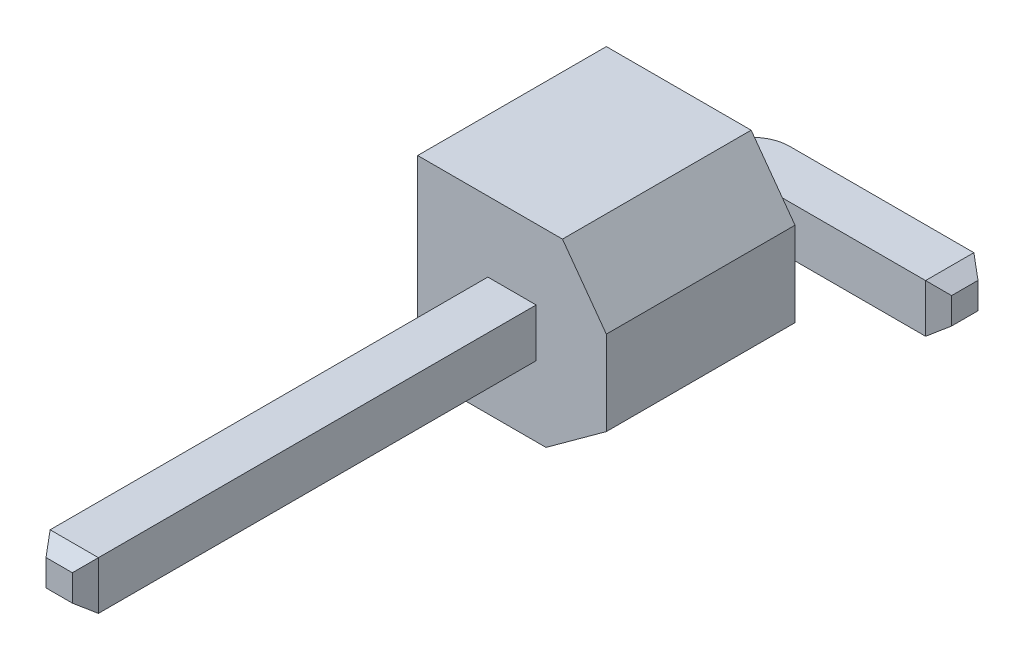
ISO-10303-21;
HEADER;
FILE_DESCRIPTION(('STEP AP214'),'2;1');
FILE_NAME('part.step','',(''),(''),'','','');
FILE_SCHEMA(('AUTOMOTIVE_DESIGN { 1 0 10303 214 1 1 1 1 }'));
ENDSEC;
DATA;
#1=APPLICATION_CONTEXT('core data for automotive mechanical design processes');
#2=APPLICATION_PROTOCOL_DEFINITION('international standard','automotive_design',2000,#1);
#3=PRODUCT_CONTEXT('',#1,'mechanical');
#4=PRODUCT('Part','Part','',(#3));
#5=PRODUCT_RELATED_PRODUCT_CATEGORY('part','',(#4));
#6=PRODUCT_DEFINITION_FORMATION('','',#4);
#7=PRODUCT_DEFINITION_CONTEXT('part definition',#1,'design');
#8=PRODUCT_DEFINITION('design','',#6,#7);
#9=PRODUCT_DEFINITION_SHAPE('','',#8);
#10=(LENGTH_UNIT() NAMED_UNIT(*) SI_UNIT(.MILLI.,.METRE.));
#11=(NAMED_UNIT(*) PLANE_ANGLE_UNIT() SI_UNIT($,.RADIAN.));
#12=(NAMED_UNIT(*) SI_UNIT($,.STERADIAN.) SOLID_ANGLE_UNIT());
#13=UNCERTAINTY_MEASURE_WITH_UNIT(LENGTH_MEASURE(1.E-05),#10,'distance_accuracy_value','');
#14=(GEOMETRIC_REPRESENTATION_CONTEXT(3) GLOBAL_UNCERTAINTY_ASSIGNED_CONTEXT((#13)) GLOBAL_UNIT_ASSIGNED_CONTEXT((#10,
#11,#12)) REPRESENTATION_CONTEXT('',''));
#15=CARTESIAN_POINT('',(0.,0.,0.));
#16=DIRECTION('',(0.,0.,1.));
#17=DIRECTION('',(1.,0.,0.));
#18=AXIS2_PLACEMENT_3D('',#15,#16,#17);
#19=CARTESIAN_POINT('',(0.32,0.32,-0.905096679918781));
#20=DIRECTION('',(1.,0.,0.));
#21=DIRECTION('',(0.,1.,0.));
#22=AXIS2_PLACEMENT_3D('',#19,#20,#21);
#23=PLANE('',#22);
#24=DIRECTION('',(0.,0.,1.));
#25=VECTOR('',#24,1.);
#26=CARTESIAN_POINT('',(0.32,-0.32,-0.905096679918781));
#27=LINE('',#26,#25);
#28=CARTESIAN_POINT('',(0.32,-0.32,0.64));
#29=VERTEX_POINT('',#28);
#30=CARTESIAN_POINT('',(0.32,-0.32,1.));
#31=VERTEX_POINT('',#30);
#32=EDGE_CURVE('E199',#29,#31,#27,.T.);
#33=ORIENTED_EDGE('',*,*,#32,.F.);
#34=DIRECTION('',(0.,-1.,0.));
#35=VECTOR('',#34,1.);
#36=CARTESIAN_POINT('',(0.32,-0.32,0.64));
#37=LINE('',#36,#35);
#38=CARTESIAN_POINT('',(0.32,0.32,0.64));
#39=VERTEX_POINT('',#38);
#40=EDGE_CURVE('E184',#39,#29,#37,.T.);
#41=ORIENTED_EDGE('',*,*,#40,.F.);
#42=DIRECTION('',(0.,0.,1.));
#43=VECTOR('',#42,1.);
#44=CARTESIAN_POINT('',(0.32,0.32,-0.905096679918781));
#45=LINE('',#44,#43);
#46=CARTESIAN_POINT('',(0.32,0.32,1.));
#47=VERTEX_POINT('',#46);
#48=EDGE_CURVE('E197',#39,#47,#45,.T.);
#49=ORIENTED_EDGE('',*,*,#48,.T.);
#50=DIRECTION('',(0.,-1.,0.));
#51=VECTOR('',#50,1.);
#52=CARTESIAN_POINT('',(0.32,0.,1.));
#53=LINE('',#52,#51);
#54=EDGE_CURVE('E259',#47,#31,#53,.T.);
#55=ORIENTED_EDGE('',*,*,#54,.T.);
#56=EDGE_LOOP('',(#33,#41,#49,#55));
#57=FACE_BOUND('',#56,.T.);
#58=ADVANCED_FACE('F35',(#57),#23,.T.);
#59=CARTESIAN_POINT('',(1.25,-1.25,3.5));
#60=DIRECTION('',(-1.,0.,0.));
#61=DIRECTION('',(0.,0.,1.));
#62=AXIS2_PLACEMENT_3D('',#59,#60,#61);
#63=PLANE('',#62);
#64=DIRECTION('',(0.,1.,0.));
#65=VECTOR('',#64,1.);
#66=CARTESIAN_POINT('',(1.25,-1.25,1.));
#67=LINE('',#66,#65);
#68=CARTESIAN_POINT('',(1.25,-0.668765977595712,1.));
#69=VERTEX_POINT('',#68);
#70=CARTESIAN_POINT('',(1.25,0.449999999999996,1.));
#71=VERTEX_POINT('',#70);
#72=EDGE_CURVE('E230',#69,#71,#67,.T.);
#73=ORIENTED_EDGE('',*,*,#72,.T.);
#74=DIRECTION('',(0.,0.,1.));
#75=VECTOR('',#74,1.);
#76=CARTESIAN_POINT('',(1.25,0.449999999999996,3.5));
#77=LINE('',#76,#75);
#78=CARTESIAN_POINT('',(1.25,0.449999999999996,3.5));
#79=VERTEX_POINT('',#78);
#80=EDGE_CURVE('E56',#71,#79,#77,.T.);
#81=ORIENTED_EDGE('',*,*,#80,.T.);
#82=DIRECTION('',(0.,1.,0.));
#83=VECTOR('',#82,1.);
#84=CARTESIAN_POINT('',(1.25,-1.25,3.5));
#85=LINE('',#84,#83);
#86=CARTESIAN_POINT('',(1.25,-0.668765977595712,3.5));
#87=VERTEX_POINT('',#86);
#88=EDGE_CURVE('E231',#87,#79,#85,.T.);
#89=ORIENTED_EDGE('',*,*,#88,.F.);
#90=DIRECTION('',(0.,0.,-1.));
#91=VECTOR('',#90,1.);
#92=CARTESIAN_POINT('',(1.25,-0.668765977595712,3.5));
#93=LINE('',#92,#91);
#94=EDGE_CURVE('E331',#87,#69,#93,.T.);
#95=ORIENTED_EDGE('',*,*,#94,.T.);
#96=EDGE_LOOP('',(#73,#81,#89,#95));
#97=FACE_BOUND('',#96,.T.);
#98=ADVANCED_FACE('F352',(#97),#63,.F.);
#99=CARTESIAN_POINT('',(-1.25,1.25,3.5));
#100=DIRECTION('',(0.,-1.,0.));
#101=DIRECTION('',(0.,0.,-1.));
#102=AXIS2_PLACEMENT_3D('',#99,#100,#101);
#103=PLANE('',#102);
#104=DIRECTION('',(-1.,0.,0.));
#105=VECTOR('',#104,1.);
#106=CARTESIAN_POINT('',(-1.25,1.25,3.5));
#107=LINE('',#106,#105);
#108=CARTESIAN_POINT('',(0.668765977595712,1.25,3.5));
#109=VERTEX_POINT('',#108);
#110=CARTESIAN_POINT('',(-1.25,1.25,3.5));
#111=VERTEX_POINT('',#110);
#112=EDGE_CURVE('E233',#109,#111,#107,.T.);
#113=ORIENTED_EDGE('',*,*,#112,.F.);
#114=DIRECTION('',(0.,0.,-1.));
#115=VECTOR('',#114,1.);
#116=CARTESIAN_POINT('',(0.668765977595712,1.25,3.5));
#117=LINE('',#116,#115);
#118=CARTESIAN_POINT('',(0.668765977595712,1.25,1.));
#119=VERTEX_POINT('',#118);
#120=EDGE_CURVE('E305',#109,#119,#117,.T.);
#121=ORIENTED_EDGE('',*,*,#120,.T.);
#122=DIRECTION('',(-1.,0.,0.));
#123=VECTOR('',#122,1.);
#124=CARTESIAN_POINT('',(-1.25,1.25,1.));
#125=LINE('',#124,#123);
#126=CARTESIAN_POINT('',(-1.25,1.25,1.));
#127=VERTEX_POINT('',#126);
#128=EDGE_CURVE('E242',#119,#127,#125,.T.);
#129=ORIENTED_EDGE('',*,*,#128,.T.);
#130=DIRECTION('',(0.,0.,-1.));
#131=VECTOR('',#130,1.);
#132=CARTESIAN_POINT('',(-1.25,1.25,3.5));
#133=LINE('',#132,#131);
#134=EDGE_CURVE('E249',#111,#127,#133,.T.);
#135=ORIENTED_EDGE('',*,*,#134,.F.);
#136=EDGE_LOOP('',(#113,#121,#129,#135));
#137=FACE_BOUND('',#136,.T.);
#138=ADVANCED_FACE('F344',(#137),#103,.F.);
#139=CARTESIAN_POINT('',(-1.25,-1.25,3.5));
#140=DIRECTION('',(1.,0.,0.));
#141=DIRECTION('',(0.,0.,-1.));
#142=AXIS2_PLACEMENT_3D('',#139,#140,#141);
#143=PLANE('',#142);
#144=DIRECTION('',(0.,-1.,0.));
#145=VECTOR('',#144,1.);
#146=CARTESIAN_POINT('',(-1.25,-1.25,1.));
#147=LINE('',#146,#145);
#148=CARTESIAN_POINT('',(-1.25,-1.25,1.));
#149=VERTEX_POINT('',#148);
#150=EDGE_CURVE('E244',#127,#149,#147,.T.);
#151=ORIENTED_EDGE('',*,*,#150,.T.);
#152=DIRECTION('',(0.,0.,-1.));
#153=VECTOR('',#152,1.);
#154=CARTESIAN_POINT('',(-1.25,-1.25,3.5));
#155=LINE('',#154,#153);
#156=CARTESIAN_POINT('',(-1.25,-1.25,3.5));
#157=VERTEX_POINT('',#156);
#158=EDGE_CURVE('E240',#157,#149,#155,.T.);
#159=ORIENTED_EDGE('',*,*,#158,.F.);
#160=DIRECTION('',(0.,-1.,0.));
#161=VECTOR('',#160,1.);
#162=CARTESIAN_POINT('',(-1.25,-1.25,3.5));
#163=LINE('',#162,#161);
#164=EDGE_CURVE('E236',#111,#157,#163,.T.);
#165=ORIENTED_EDGE('',*,*,#164,.F.);
#166=ORIENTED_EDGE('',*,*,#134,.T.);
#167=EDGE_LOOP('',(#151,#159,#165,#166));
#168=FACE_BOUND('',#167,.T.);
#169=ADVANCED_FACE('F360',(#168),#143,.F.);
#170=CARTESIAN_POINT('',(-1.25,-1.25,3.5));
#171=DIRECTION('',(0.,1.,0.));
#172=DIRECTION('',(0.,0.,1.));
#173=AXIS2_PLACEMENT_3D('',#170,#171,#172);
#174=PLANE('',#173);
#175=DIRECTION('',(1.,0.,0.));
#176=VECTOR('',#175,1.);
#177=CARTESIAN_POINT('',(-1.25,-1.25,1.));
#178=LINE('',#177,#176);
#179=CARTESIAN_POINT('',(0.449999999999996,-1.25,1.));
#180=VERTEX_POINT('',#179);
#181=EDGE_CURVE('E234',#149,#180,#178,.T.);
#182=ORIENTED_EDGE('',*,*,#181,.T.);
#183=DIRECTION('',(0.,0.,1.));
#184=VECTOR('',#183,1.);
#185=CARTESIAN_POINT('',(0.449999999999996,-1.25,3.5));
#186=LINE('',#185,#184);
#187=CARTESIAN_POINT('',(0.449999999999996,-1.25,3.5));
#188=VERTEX_POINT('',#187);
#189=EDGE_CURVE('E11',#180,#188,#186,.T.);
#190=ORIENTED_EDGE('',*,*,#189,.T.);
#191=DIRECTION('',(1.,0.,0.));
#192=VECTOR('',#191,1.);
#193=CARTESIAN_POINT('',(-1.25,-1.25,3.5));
#194=LINE('',#193,#192);
#195=EDGE_CURVE('E238',#157,#188,#194,.T.);
#196=ORIENTED_EDGE('',*,*,#195,.F.);
#197=ORIENTED_EDGE('',*,*,#158,.T.);
#198=EDGE_LOOP('',(#182,#190,#196,#197));
#199=FACE_BOUND('',#198,.T.);
#200=ADVANCED_FACE('F357',(#199),#174,.F.);
#201=CARTESIAN_POINT('',(0.,0.,3.5));
#202=DIRECTION('',(0.,0.,-1.));
#203=DIRECTION('',(-1.,0.,0.));
#204=AXIS2_PLACEMENT_3D('',#201,#202,#203);
#205=PLANE('',#204);
#206=DIRECTION('',(1.,0.,0.));
#207=VECTOR('',#206,1.);
#208=CARTESIAN_POINT('',(0.,0.32,3.5));
#209=LINE('',#208,#207);
#210=CARTESIAN_POINT('',(-0.32,0.32,3.5));
#211=VERTEX_POINT('',#210);
#212=CARTESIAN_POINT('',(0.32,0.32,3.5));
#213=VERTEX_POINT('',#212);
#214=EDGE_CURVE('E217',#211,#213,#209,.T.);
#215=ORIENTED_EDGE('',*,*,#214,.T.);
#216=DIRECTION('',(0.,-1.,0.));
#217=VECTOR('',#216,1.);
#218=CARTESIAN_POINT('',(0.32,0.,3.5));
#219=LINE('',#218,#217);
#220=CARTESIAN_POINT('',(0.32,-0.32,3.5));
#221=VERTEX_POINT('',#220);
#222=EDGE_CURVE('E227',#213,#221,#219,.T.);
#223=ORIENTED_EDGE('',*,*,#222,.T.);
#224=DIRECTION('',(-1.,0.,0.));
#225=VECTOR('',#224,1.);
#226=CARTESIAN_POINT('',(0.,-0.32,3.5));
#227=LINE('',#226,#225);
#228=CARTESIAN_POINT('',(-0.32,-0.32,3.5));
#229=VERTEX_POINT('',#228);
#230=EDGE_CURVE('E224',#221,#229,#227,.T.);
#231=ORIENTED_EDGE('',*,*,#230,.T.);
#232=DIRECTION('',(0.,1.,0.));
#233=VECTOR('',#232,1.);
#234=CARTESIAN_POINT('',(-0.32,0.,3.5));
#235=LINE('',#234,#233);
#236=EDGE_CURVE('E221',#229,#211,#235,.T.);
#237=ORIENTED_EDGE('',*,*,#236,.T.);
#238=EDGE_LOOP('',(#215,#223,#231,#237));
#239=FACE_BOUND('',#238,.T.);
#240=ORIENTED_EDGE('',*,*,#88,.T.);
#241=DIRECTION('',(0.587785252292471,-0.809016994374949,0.));
#242=VECTOR('',#241,1.);
#243=CARTESIAN_POINT('',(0.668765977595712,1.25,3.5));
#244=LINE('',#243,#242);
#245=EDGE_CURVE('E43',#79,#109,#244,.F.);
#246=ORIENTED_EDGE('',*,*,#245,.T.);
#247=ORIENTED_EDGE('',*,*,#112,.T.);
#248=ORIENTED_EDGE('',*,*,#164,.T.);
#249=ORIENTED_EDGE('',*,*,#195,.T.);
#250=DIRECTION('',(-0.809016994374949,-0.587785252292471,0.));
#251=VECTOR('',#250,1.);
#252=CARTESIAN_POINT('',(1.25,-0.668765977595712,3.5));
#253=LINE('',#252,#251);
#254=EDGE_CURVE('E335',#188,#87,#253,.F.);
#255=ORIENTED_EDGE('',*,*,#254,.T.);
#256=EDGE_LOOP('',(#240,#246,#247,#248,#249,#255));
#257=FACE_BOUND('',#256,.T.);
#258=ADVANCED_FACE('F339',(#239,#257),#205,.F.);
#259=CARTESIAN_POINT('',(0.,0.,1.));
#260=DIRECTION('',(0.,0.,-1.));
#261=DIRECTION('',(-1.,0.,0.));
#262=AXIS2_PLACEMENT_3D('',#259,#260,#261);
#263=PLANE('',#262);
#264=ORIENTED_EDGE('',*,*,#54,.F.);
#265=DIRECTION('',(1.,0.,0.));
#266=VECTOR('',#265,1.);
#267=CARTESIAN_POINT('',(0.,0.32,1.));
#268=LINE('',#267,#266);
#269=CARTESIAN_POINT('',(-0.32,0.32,1.));
#270=VERTEX_POINT('',#269);
#271=EDGE_CURVE('E205',#270,#47,#268,.T.);
#272=ORIENTED_EDGE('',*,*,#271,.F.);
#273=DIRECTION('',(0.,1.,0.));
#274=VECTOR('',#273,1.);
#275=CARTESIAN_POINT('',(-0.32,0.,1.));
#276=LINE('',#275,#274);
#277=CARTESIAN_POINT('',(-0.32,-0.32,1.));
#278=VERTEX_POINT('',#277);
#279=EDGE_CURVE('E253',#278,#270,#276,.T.);
#280=ORIENTED_EDGE('',*,*,#279,.F.);
#281=DIRECTION('',(-1.,0.,0.));
#282=VECTOR('',#281,1.);
#283=CARTESIAN_POINT('',(0.,-0.32,1.));
#284=LINE('',#283,#282);
#285=EDGE_CURVE('E256',#31,#278,#284,.T.);
#286=ORIENTED_EDGE('',*,*,#285,.F.);
#287=EDGE_LOOP('',(#264,#272,#280,#286));
#288=FACE_BOUND('',#287,.T.);
#289=ORIENTED_EDGE('',*,*,#128,.F.);
#290=DIRECTION('',(-0.587785252292471,0.809016994374949,0.));
#291=VECTOR('',#290,1.);
#292=CARTESIAN_POINT('',(1.03212333765075,0.749881498950104,1.));
#293=LINE('',#292,#291);
#294=EDGE_CURVE('E329',#119,#71,#293,.F.);
#295=ORIENTED_EDGE('',*,*,#294,.T.);
#296=ORIENTED_EDGE('',*,*,#72,.F.);
#297=DIRECTION('',(0.809016994374949,0.587785252292471,0.));
#298=VECTOR('',#297,1.);
#299=CARTESIAN_POINT('',(0.749881498950104,-1.03212333765075,1.));
#300=LINE('',#299,#298);
#301=EDGE_CURVE('E327',#69,#180,#300,.F.);
#302=ORIENTED_EDGE('',*,*,#301,.T.);
#303=ORIENTED_EDGE('',*,*,#181,.F.);
#304=ORIENTED_EDGE('',*,*,#150,.F.);
#305=EDGE_LOOP('',(#289,#295,#296,#302,#303,#304));
#306=FACE_BOUND('',#305,.T.);
#307=ADVANCED_FACE('F350',(#288,#306),#263,.T.);
#308=CARTESIAN_POINT('',(0.,0.,0.));
#309=DIRECTION('',(0.,0.,1.));
#310=DIRECTION('',(1.,0.,0.));
#311=AXIS2_PLACEMENT_3D('',#308,#309,#310);
#312=PLANE('',#311);
#313=DIRECTION('',(1.,0.,0.));
#314=VECTOR('',#313,1.);
#315=CARTESIAN_POINT('',(-0.32,0.32,0.));
#316=LINE('',#315,#314);
#317=CARTESIAN_POINT('',(0.18,0.32,0.));
#318=VERTEX_POINT('',#317);
#319=CARTESIAN_POINT('',(2.62,0.32,0.));
#320=VERTEX_POINT('',#319);
#321=EDGE_CURVE('E214',#318,#320,#316,.T.);
#322=ORIENTED_EDGE('',*,*,#321,.T.);
#323=DIRECTION('',(0.,-1.,0.));
#324=VECTOR('',#323,1.);
#325=CARTESIAN_POINT('',(2.62,-0.32,0.));
#326=LINE('',#325,#324);
#327=CARTESIAN_POINT('',(2.62,-0.32,0.));
#328=VERTEX_POINT('',#327);
#329=EDGE_CURVE('E300',#320,#328,#326,.T.);
#330=ORIENTED_EDGE('',*,*,#329,.T.);
#331=DIRECTION('',(-1.,0.,0.));
#332=VECTOR('',#331,1.);
#333=CARTESIAN_POINT('',(-0.32,-0.32,0.));
#334=LINE('',#333,#332);
#335=CARTESIAN_POINT('',(0.18,-0.32,0.));
#336=VERTEX_POINT('',#335);
#337=EDGE_CURVE('E218',#328,#336,#334,.T.);
#338=ORIENTED_EDGE('',*,*,#337,.T.);
#339=DIRECTION('',(0.,1.,0.));
#340=VECTOR('',#339,1.);
#341=CARTESIAN_POINT('',(0.18,0.32,0.));
#342=LINE('',#341,#340);
#343=EDGE_CURVE('E261',#336,#318,#342,.T.);
#344=ORIENTED_EDGE('',*,*,#343,.T.);
#345=EDGE_LOOP('',(#322,#330,#338,#344));
#346=FACE_BOUND('',#345,.T.);
#347=ADVANCED_FACE('F447',(#346),#312,.F.);
#348=CARTESIAN_POINT('',(-0.32,0.32,-0.905096679918781));
#349=DIRECTION('',(0.,1.,0.));
#350=DIRECTION('',(0.,0.,1.));
#351=AXIS2_PLACEMENT_3D('',#348,#349,#350);
#352=PLANE('',#351);
#353=DIRECTION('',(-1.,0.,0.));
#354=VECTOR('',#353,1.);
#355=CARTESIAN_POINT('',(2.82,0.32,0.64));
#356=LINE('',#355,#354);
#357=CARTESIAN_POINT('',(2.62,0.32,0.64));
#358=VERTEX_POINT('',#357);
#359=EDGE_CURVE('E180',#358,#39,#356,.T.);
#360=ORIENTED_EDGE('',*,*,#359,.F.);
#361=DIRECTION('',(0.,0.,-1.));
#362=VECTOR('',#361,1.);
#363=CARTESIAN_POINT('',(2.62,0.32,-0.905096679918781));
#364=LINE('',#363,#362);
#365=EDGE_CURVE('E298',#358,#320,#364,.T.);
#366=ORIENTED_EDGE('',*,*,#365,.T.);
#367=ORIENTED_EDGE('',*,*,#321,.F.);
#368=CARTESIAN_POINT('',(0.18,0.32,0.5));
#369=DIRECTION('',(0.,1.,0.));
#370=DIRECTION('',(0.,0.,1.));
#371=AXIS2_PLACEMENT_3D('',#368,#369,#370);
#372=CIRCLE('',#371,0.5);
#373=CARTESIAN_POINT('',(-0.32,0.32,0.5));
#374=VERTEX_POINT('',#373);
#375=EDGE_CURVE('E264',#318,#374,#372,.T.);
#376=ORIENTED_EDGE('',*,*,#375,.T.);
#377=DIRECTION('',(0.,0.,1.));
#378=VECTOR('',#377,1.);
#379=CARTESIAN_POINT('',(-0.32,0.32,-0.905096679918781));
#380=LINE('',#379,#378);
#381=EDGE_CURVE('E209',#374,#270,#380,.T.);
#382=ORIENTED_EDGE('',*,*,#381,.T.);
#383=ORIENTED_EDGE('',*,*,#271,.T.);
#384=ORIENTED_EDGE('',*,*,#48,.F.);
#385=EDGE_LOOP('',(#360,#366,#367,#376,#382,#383,#384));
#386=FACE_BOUND('',#385,.T.);
#387=ADVANCED_FACE('F203',(#386),#352,.T.);
#388=CARTESIAN_POINT('',(-0.32,0.32,-0.905096679918781));
#389=DIRECTION('',(-1.,0.,0.));
#390=DIRECTION('',(0.,-1.,0.));
#391=AXIS2_PLACEMENT_3D('',#388,#389,#390);
#392=PLANE('',#391);
#393=ORIENTED_EDGE('',*,*,#381,.F.);
#394=DIRECTION('',(0.,1.,0.));
#395=VECTOR('',#394,1.);
#396=CARTESIAN_POINT('',(-0.32,-0.32,0.5));
#397=LINE('',#396,#395);
#398=CARTESIAN_POINT('',(-0.32,-0.32,0.5));
#399=VERTEX_POINT('',#398);
#400=EDGE_CURVE('E266',#374,#399,#397,.F.);
#401=ORIENTED_EDGE('',*,*,#400,.T.);
#402=DIRECTION('',(0.,0.,1.));
#403=VECTOR('',#402,1.);
#404=CARTESIAN_POINT('',(-0.32,-0.32,-0.905096679918781));
#405=LINE('',#404,#403);
#406=EDGE_CURVE('E424',#399,#278,#405,.T.);
#407=ORIENTED_EDGE('',*,*,#406,.T.);
#408=ORIENTED_EDGE('',*,*,#279,.T.);
#409=EDGE_LOOP('',(#393,#401,#407,#408));
#410=FACE_BOUND('',#409,.T.);
#411=ADVANCED_FACE('F389',(#410),#392,.T.);
#412=CARTESIAN_POINT('',(-0.32,-0.32,-0.905096679918781));
#413=DIRECTION('',(0.,-1.,0.));
#414=DIRECTION('',(0.,0.,-1.));
#415=AXIS2_PLACEMENT_3D('',#412,#413,#414);
#416=PLANE('',#415);
#417=ORIENTED_EDGE('',*,*,#337,.F.);
#418=DIRECTION('',(0.,0.,1.));
#419=VECTOR('',#418,1.);
#420=CARTESIAN_POINT('',(2.62,-0.32,-0.905096679918781));
#421=LINE('',#420,#419);
#422=CARTESIAN_POINT('',(2.62,-0.32,0.64));
#423=VERTEX_POINT('',#422);
#424=EDGE_CURVE('E302',#328,#423,#421,.T.);
#425=ORIENTED_EDGE('',*,*,#424,.T.);
#426=DIRECTION('',(-1.,0.,0.));
#427=VECTOR('',#426,1.);
#428=CARTESIAN_POINT('',(2.82,-0.32,0.64));
#429=LINE('',#428,#427);
#430=EDGE_CURVE('E193',#423,#29,#429,.T.);
#431=ORIENTED_EDGE('',*,*,#430,.T.);
#432=ORIENTED_EDGE('',*,*,#32,.T.);
#433=ORIENTED_EDGE('',*,*,#285,.T.);
#434=ORIENTED_EDGE('',*,*,#406,.F.);
#435=CARTESIAN_POINT('',(0.18,-0.32,0.5));
#436=DIRECTION('',(0.,-1.,0.));
#437=DIRECTION('',(0.,0.,-1.));
#438=AXIS2_PLACEMENT_3D('',#435,#436,#437);
#439=CIRCLE('',#438,0.5);
#440=EDGE_CURVE('E268',#399,#336,#439,.T.);
#441=ORIENTED_EDGE('',*,*,#440,.T.);
#442=EDGE_LOOP('',(#417,#425,#431,#432,#433,#434,#441));
#443=FACE_BOUND('',#442,.T.);
#444=ADVANCED_FACE('F380',(#443),#416,.T.);
#445=CARTESIAN_POINT('',(0.32,0.32,9.3));
#446=VERTEX_POINT('',#445);
#447=EDGE_CURVE('E192',#213,#446,#45,.T.);
#448=ORIENTED_EDGE('',*,*,#447,.T.);
#449=DIRECTION('',(0.,-1.,0.));
#450=VECTOR('',#449,1.);
#451=CARTESIAN_POINT('',(0.32,0.32,9.3));
#452=LINE('',#451,#450);
#453=CARTESIAN_POINT('',(0.32,-0.32,9.3));
#454=VERTEX_POINT('',#453);
#455=EDGE_CURVE('E287',#446,#454,#452,.T.);
#456=ORIENTED_EDGE('',*,*,#455,.T.);
#457=EDGE_CURVE('E422',#221,#454,#27,.T.);
#458=ORIENTED_EDGE('',*,*,#457,.F.);
#459=ORIENTED_EDGE('',*,*,#222,.F.);
#460=EDGE_LOOP('',(#448,#456,#458,#459));
#461=FACE_BOUND('',#460,.T.);
#462=ADVANCED_FACE('F371',(#461),#23,.T.);
#463=ORIENTED_EDGE('',*,*,#457,.T.);
#464=DIRECTION('',(-1.,0.,0.));
#465=VECTOR('',#464,1.);
#466=CARTESIAN_POINT('',(-0.32,-0.32,9.3));
#467=LINE('',#466,#465);
#468=CARTESIAN_POINT('',(-0.32,-0.32,9.3));
#469=VERTEX_POINT('',#468);
#470=EDGE_CURVE('E285',#454,#469,#467,.T.);
#471=ORIENTED_EDGE('',*,*,#470,.T.);
#472=EDGE_CURVE('E421',#229,#469,#405,.T.);
#473=ORIENTED_EDGE('',*,*,#472,.F.);
#474=ORIENTED_EDGE('',*,*,#230,.F.);
#475=EDGE_LOOP('',(#463,#471,#473,#474));
#476=FACE_BOUND('',#475,.T.);
#477=ADVANCED_FACE('F379',(#476),#416,.T.);
#478=ORIENTED_EDGE('',*,*,#472,.T.);
#479=DIRECTION('',(0.,1.,0.));
#480=VECTOR('',#479,1.);
#481=CARTESIAN_POINT('',(-0.32,0.32,9.3));
#482=LINE('',#481,#480);
#483=CARTESIAN_POINT('',(-0.32,0.32,9.3));
#484=VERTEX_POINT('',#483);
#485=EDGE_CURVE('E283',#469,#484,#482,.T.);
#486=ORIENTED_EDGE('',*,*,#485,.T.);
#487=EDGE_CURVE('E206',#211,#484,#380,.T.);
#488=ORIENTED_EDGE('',*,*,#487,.F.);
#489=ORIENTED_EDGE('',*,*,#236,.F.);
#490=EDGE_LOOP('',(#478,#486,#488,#489));
#491=FACE_BOUND('',#490,.T.);
#492=ADVANCED_FACE('F386',(#491),#392,.T.);
#493=ORIENTED_EDGE('',*,*,#487,.T.);
#494=DIRECTION('',(1.,0.,0.));
#495=VECTOR('',#494,1.);
#496=CARTESIAN_POINT('',(-0.32,0.32,9.3));
#497=LINE('',#496,#495);
#498=EDGE_CURVE('E280',#484,#446,#497,.T.);
#499=ORIENTED_EDGE('',*,*,#498,.T.);
#500=ORIENTED_EDGE('',*,*,#447,.F.);
#501=ORIENTED_EDGE('',*,*,#214,.F.);
#502=EDGE_LOOP('',(#493,#499,#500,#501));
#503=FACE_BOUND('',#502,.T.);
#504=ADVANCED_FACE('F396',(#503),#352,.T.);
#505=CARTESIAN_POINT('',(0.,0.,9.5));
#506=DIRECTION('',(0.,0.,1.));
#507=DIRECTION('',(1.,0.,0.));
#508=AXIS2_PLACEMENT_3D('',#505,#506,#507);
#509=PLANE('',#508);
#510=DIRECTION('',(0.,1.,0.));
#511=VECTOR('',#510,1.);
#512=CARTESIAN_POINT('',(0.174691494398928,0.,9.5));
#513=LINE('',#512,#511);
#514=CARTESIAN_POINT('',(0.174691494398928,-0.174691494398928,9.5));
#515=VERTEX_POINT('',#514);
#516=CARTESIAN_POINT('',(0.174691494398927,0.174691494398927,9.5));
#517=VERTEX_POINT('',#516);
#518=EDGE_CURVE('E271',#515,#517,#513,.T.);
#519=ORIENTED_EDGE('',*,*,#518,.T.);
#520=DIRECTION('',(-1.,0.,0.));
#521=VECTOR('',#520,1.);
#522=CARTESIAN_POINT('',(0.,0.174691494398927,9.5));
#523=LINE('',#522,#521);
#524=CARTESIAN_POINT('',(-0.174691494398927,0.174691494398927,9.5));
#525=VERTEX_POINT('',#524);
#526=EDGE_CURVE('E277',#517,#525,#523,.T.);
#527=ORIENTED_EDGE('',*,*,#526,.T.);
#528=DIRECTION('',(0.,-1.,0.));
#529=VECTOR('',#528,1.);
#530=CARTESIAN_POINT('',(-0.174691494398927,0.,9.5));
#531=LINE('',#530,#529);
#532=CARTESIAN_POINT('',(-0.174691494398927,-0.174691494398928,9.5));
#533=VERTEX_POINT('',#532);
#534=EDGE_CURVE('E275',#525,#533,#531,.T.);
#535=ORIENTED_EDGE('',*,*,#534,.T.);
#536=DIRECTION('',(1.,0.,0.));
#537=VECTOR('',#536,1.);
#538=CARTESIAN_POINT('',(0.,-0.174691494398928,9.5));
#539=LINE('',#538,#537);
#540=EDGE_CURVE('E273',#533,#515,#539,.T.);
#541=ORIENTED_EDGE('',*,*,#540,.T.);
#542=EDGE_LOOP('',(#519,#527,#535,#541));
#543=FACE_BOUND('',#542,.T.);
#544=ADVANCED_FACE('F411',(#543),#509,.T.);
#545=CARTESIAN_POINT('',(2.82,-0.32,0.64));
#546=DIRECTION('',(0.,0.,-1.));
#547=DIRECTION('',(-1.,0.,0.));
#548=AXIS2_PLACEMENT_3D('',#545,#546,#547);
#549=PLANE('',#548);
#550=ORIENTED_EDGE('',*,*,#430,.F.);
#551=DIRECTION('',(0.,1.,0.));
#552=VECTOR('',#551,1.);
#553=CARTESIAN_POINT('',(2.62,0.32,0.64));
#554=LINE('',#553,#552);
#555=EDGE_CURVE('E187',#423,#358,#554,.T.);
#556=ORIENTED_EDGE('',*,*,#555,.T.);
#557=ORIENTED_EDGE('',*,*,#359,.T.);
#558=ORIENTED_EDGE('',*,*,#40,.T.);
#559=EDGE_LOOP('',(#550,#556,#557,#558));
#560=FACE_BOUND('',#559,.T.);
#561=ADVANCED_FACE('F183',(#560),#549,.F.);
#562=CARTESIAN_POINT('',(2.82,0.,0.));
#563=DIRECTION('',(1.,0.,0.));
#564=DIRECTION('',(0.,1.,0.));
#565=AXIS2_PLACEMENT_3D('',#562,#563,#564);
#566=PLANE('',#565);
#567=DIRECTION('',(0.,1.,0.));
#568=VECTOR('',#567,1.);
#569=CARTESIAN_POINT('',(2.82,0.32,0.145308505601073));
#570=LINE('',#569,#568);
#571=CARTESIAN_POINT('',(2.82,-0.174691494398927,0.145308505601073));
#572=VERTEX_POINT('',#571);
#573=CARTESIAN_POINT('',(2.82,0.174691494398927,0.145308505601073));
#574=VERTEX_POINT('',#573);
#575=EDGE_CURVE('E293',#572,#574,#570,.T.);
#576=ORIENTED_EDGE('',*,*,#575,.T.);
#577=DIRECTION('',(0.,0.,1.));
#578=VECTOR('',#577,1.);
#579=CARTESIAN_POINT('',(2.82,0.174691494398927,0.));
#580=LINE('',#579,#578);
#581=CARTESIAN_POINT('',(2.82,0.174691494398927,0.494691494398927));
#582=VERTEX_POINT('',#581);
#583=EDGE_CURVE('E295',#574,#582,#580,.T.);
#584=ORIENTED_EDGE('',*,*,#583,.T.);
#585=DIRECTION('',(0.,-1.,0.));
#586=VECTOR('',#585,1.);
#587=CARTESIAN_POINT('',(2.82,-0.32,0.494691494398927));
#588=LINE('',#587,#586);
#589=CARTESIAN_POINT('',(2.82,-0.174691494398927,0.494691494398927));
#590=VERTEX_POINT('',#589);
#591=EDGE_CURVE('E289',#582,#590,#588,.T.);
#592=ORIENTED_EDGE('',*,*,#591,.T.);
#593=DIRECTION('',(0.,0.,-1.));
#594=VECTOR('',#593,1.);
#595=CARTESIAN_POINT('',(2.82,-0.174691494398927,0.));
#596=LINE('',#595,#594);
#597=EDGE_CURVE('E291',#590,#572,#596,.T.);
#598=ORIENTED_EDGE('',*,*,#597,.T.);
#599=EDGE_LOOP('',(#576,#584,#592,#598));
#600=FACE_BOUND('',#599,.T.);
#601=ADVANCED_FACE('F560',(#600),#566,.T.);
#602=CARTESIAN_POINT('',(0.18,0.,0.5));
#603=DIRECTION('',(0.,-1.,0.));
#604=DIRECTION('',(1.,0.,0.));
#605=AXIS2_PLACEMENT_3D('',#602,#603,#604);
#606=CYLINDRICAL_SURFACE('',#605,0.5);
#607=ORIENTED_EDGE('',*,*,#440,.F.);
#608=ORIENTED_EDGE('',*,*,#400,.F.);
#609=ORIENTED_EDGE('',*,*,#375,.F.);
#610=ORIENTED_EDGE('',*,*,#343,.F.);
#611=EDGE_LOOP('',(#607,#608,#609,#610));
#612=FACE_BOUND('',#611,.T.);
#613=ADVANCED_FACE('F451',(#612),#606,.T.);
#614=CARTESIAN_POINT('',(0.,-0.174691494398928,9.5));
#615=DIRECTION('',(0.,0.80901699437495,-0.58778525229247));
#616=DIRECTION('',(1.,0.,0.));
#617=AXIS2_PLACEMENT_3D('',#614,#615,#616);
#618=PLANE('',#617);
#619=DIRECTION('',(-0.506731853971384,-0.506731853971384,-0.697456562333059));
#620=VECTOR('',#619,1.);
#621=CARTESIAN_POINT('',(-0.129834706524541,-0.129834706524541,9.56174007184072));
#622=LINE('',#621,#620);
#623=EDGE_CURVE('E311',#469,#533,#622,.F.);
#624=ORIENTED_EDGE('',*,*,#623,.F.);
#625=ORIENTED_EDGE('',*,*,#470,.F.);
#626=DIRECTION('',(0.506731853971384,-0.506731853971384,-0.697456562333058));
#627=VECTOR('',#626,1.);
#628=CARTESIAN_POINT('',(0.129834706524541,-0.129834706524541,9.56174007184072));
#629=LINE('',#628,#627);
#630=EDGE_CURVE('E200',#515,#454,#629,.T.);
#631=ORIENTED_EDGE('',*,*,#630,.F.);
#632=ORIENTED_EDGE('',*,*,#540,.F.);
#633=EDGE_LOOP('',(#624,#625,#631,#632));
#634=FACE_BOUND('',#633,.T.);
#635=ADVANCED_FACE('F418',(#634),#618,.F.);
#636=CARTESIAN_POINT('',(0.174691494398928,0.,9.5));
#637=DIRECTION('',(-0.80901699437495,0.,-0.58778525229247));
#638=DIRECTION('',(0.,1.,0.));
#639=AXIS2_PLACEMENT_3D('',#636,#637,#638);
#640=PLANE('',#639);
#641=ORIENTED_EDGE('',*,*,#630,.T.);
#642=ORIENTED_EDGE('',*,*,#455,.F.);
#643=DIRECTION('',(-0.506731853971384,-0.506731853971384,0.697456562333059));
#644=VECTOR('',#643,1.);
#645=CARTESIAN_POINT('',(0.129834706524541,0.129834706524541,9.56174007184072));
#646=LINE('',#645,#644);
#647=EDGE_CURVE('E308',#517,#446,#646,.F.);
#648=ORIENTED_EDGE('',*,*,#647,.F.);
#649=ORIENTED_EDGE('',*,*,#518,.F.);
#650=EDGE_LOOP('',(#641,#642,#648,#649));
#651=FACE_BOUND('',#650,.T.);
#652=ADVANCED_FACE('F415',(#651),#640,.F.);
#653=CARTESIAN_POINT('',(-0.174691494398927,0.,9.5));
#654=DIRECTION('',(0.80901699437495,0.,-0.58778525229247));
#655=DIRECTION('',(0.,-1.,0.));
#656=AXIS2_PLACEMENT_3D('',#653,#654,#655);
#657=PLANE('',#656);
#658=ORIENTED_EDGE('',*,*,#623,.T.);
#659=ORIENTED_EDGE('',*,*,#534,.F.);
#660=DIRECTION('',(-0.506731853971384,0.506731853971384,-0.697456562333058));
#661=VECTOR('',#660,1.);
#662=CARTESIAN_POINT('',(-0.129834706524541,0.129834706524541,9.56174007184072));
#663=LINE('',#662,#661);
#664=EDGE_CURVE('E306',#484,#525,#663,.F.);
#665=ORIENTED_EDGE('',*,*,#664,.F.);
#666=ORIENTED_EDGE('',*,*,#485,.F.);
#667=EDGE_LOOP('',(#658,#659,#665,#666));
#668=FACE_BOUND('',#667,.T.);
#669=ADVANCED_FACE('F407',(#668),#657,.F.);
#670=CARTESIAN_POINT('',(0.,0.174691494398927,9.5));
#671=DIRECTION('',(0.,-0.80901699437495,-0.58778525229247));
#672=DIRECTION('',(-1.,0.,0.));
#673=AXIS2_PLACEMENT_3D('',#670,#671,#672);
#674=PLANE('',#673);
#675=ORIENTED_EDGE('',*,*,#647,.T.);
#676=ORIENTED_EDGE('',*,*,#498,.F.);
#677=ORIENTED_EDGE('',*,*,#664,.T.);
#678=ORIENTED_EDGE('',*,*,#526,.F.);
#679=EDGE_LOOP('',(#675,#676,#677,#678));
#680=FACE_BOUND('',#679,.T.);
#681=ADVANCED_FACE('F401',(#680),#674,.F.);
#682=CARTESIAN_POINT('',(2.82,-0.174691494398927,0.));
#683=DIRECTION('',(-0.587785252292475,0.809016994374946,0.));
#684=DIRECTION('',(0.,0.,-1.));
#685=AXIS2_PLACEMENT_3D('',#682,#683,#684);
#686=PLANE('',#685);
#687=DIRECTION('',(-0.697456562333053,-0.506731853971388,0.506731853971388));
#688=VECTOR('',#687,1.);
#689=CARTESIAN_POINT('',(2.88174007184072,-0.12983470652454,0.44983470652454));
#690=LINE('',#689,#688);
#691=EDGE_CURVE('E320',#423,#590,#690,.F.);
#692=ORIENTED_EDGE('',*,*,#691,.F.);
#693=ORIENTED_EDGE('',*,*,#424,.F.);
#694=DIRECTION('',(-0.697456562333053,-0.506731853971388,-0.506731853971388));
#695=VECTOR('',#694,1.);
#696=CARTESIAN_POINT('',(2.76864456563414,-0.212003401509909,0.107996598490091));
#697=LINE('',#696,#695);
#698=EDGE_CURVE('E309',#572,#328,#697,.T.);
#699=ORIENTED_EDGE('',*,*,#698,.F.);
#700=ORIENTED_EDGE('',*,*,#597,.F.);
#701=EDGE_LOOP('',(#692,#693,#699,#700));
#702=FACE_BOUND('',#701,.T.);
#703=ADVANCED_FACE('F434',(#702),#686,.F.);
#704=CARTESIAN_POINT('',(2.82,0.,0.145308505601073));
#705=DIRECTION('',(0.587785252292475,0.,-0.809016994374946));
#706=DIRECTION('',(0.,-1.,0.));
#707=AXIS2_PLACEMENT_3D('',#704,#705,#706);
#708=PLANE('',#707);
#709=ORIENTED_EDGE('',*,*,#698,.T.);
#710=ORIENTED_EDGE('',*,*,#329,.F.);
#711=DIRECTION('',(-0.697456562333053,0.506731853971388,-0.506731853971388));
#712=VECTOR('',#711,1.);
#713=CARTESIAN_POINT('',(2.88174007184072,0.12983470652454,0.19016529347546));
#714=LINE('',#713,#712);
#715=EDGE_CURVE('E318',#574,#320,#714,.T.);
#716=ORIENTED_EDGE('',*,*,#715,.F.);
#717=ORIENTED_EDGE('',*,*,#575,.F.);
#718=EDGE_LOOP('',(#709,#710,#716,#717));
#719=FACE_BOUND('',#718,.T.);
#720=ADVANCED_FACE('F504',(#719),#708,.T.);
#721=CARTESIAN_POINT('',(2.82,0.,0.494691494398927));
#722=DIRECTION('',(0.587785252292475,0.,0.809016994374946));
#723=DIRECTION('',(0.,1.,0.));
#724=AXIS2_PLACEMENT_3D('',#721,#722,#723);
#725=PLANE('',#724);
#726=ORIENTED_EDGE('',*,*,#691,.T.);
#727=ORIENTED_EDGE('',*,*,#591,.F.);
#728=DIRECTION('',(0.697456562333053,-0.506731853971388,-0.506731853971388));
#729=VECTOR('',#728,1.);
#730=CARTESIAN_POINT('',(2.88174007184072,0.12983470652454,0.44983470652454));
#731=LINE('',#730,#729);
#732=EDGE_CURVE('E316',#358,#582,#731,.T.);
#733=ORIENTED_EDGE('',*,*,#732,.F.);
#734=ORIENTED_EDGE('',*,*,#555,.F.);
#735=EDGE_LOOP('',(#726,#727,#733,#734));
#736=FACE_BOUND('',#735,.T.);
#737=ADVANCED_FACE('F439',(#736),#725,.T.);
#738=CARTESIAN_POINT('',(2.82,0.174691494398927,0.));
#739=DIRECTION('',(-0.587785252292475,-0.809016994374946,0.));
#740=DIRECTION('',(0.,0.,1.));
#741=AXIS2_PLACEMENT_3D('',#738,#739,#740);
#742=PLANE('',#741);
#743=ORIENTED_EDGE('',*,*,#715,.T.);
#744=ORIENTED_EDGE('',*,*,#365,.F.);
#745=ORIENTED_EDGE('',*,*,#732,.T.);
#746=ORIENTED_EDGE('',*,*,#583,.F.);
#747=EDGE_LOOP('',(#743,#744,#745,#746));
#748=FACE_BOUND('',#747,.T.);
#749=ADVANCED_FACE('F442',(#748),#742,.F.);
#750=CARTESIAN_POINT('',(0.668765977595712,1.25,3.5));
#751=DIRECTION('',(-0.809016994374949,-0.587785252292471,0.));
#752=DIRECTION('',(0.,0.,-1.));
#753=AXIS2_PLACEMENT_3D('',#750,#751,#752);
#754=PLANE('',#753);
#755=ORIENTED_EDGE('',*,*,#245,.F.);
#756=ORIENTED_EDGE('',*,*,#80,.F.);
#757=ORIENTED_EDGE('',*,*,#294,.F.);
#758=ORIENTED_EDGE('',*,*,#120,.F.);
#759=EDGE_LOOP('',(#755,#756,#757,#758));
#760=FACE_BOUND('',#759,.T.);
#761=ADVANCED_FACE('F347',(#760),#754,.F.);
#762=CARTESIAN_POINT('',(1.25,-0.668765977595712,3.5));
#763=DIRECTION('',(-0.587785252292471,0.809016994374949,0.));
#764=DIRECTION('',(0.,0.,-1.));
#765=AXIS2_PLACEMENT_3D('',#762,#763,#764);
#766=PLANE('',#765);
#767=ORIENTED_EDGE('',*,*,#254,.F.);
#768=ORIENTED_EDGE('',*,*,#189,.F.);
#769=ORIENTED_EDGE('',*,*,#301,.F.);
#770=ORIENTED_EDGE('',*,*,#94,.F.);
#771=EDGE_LOOP('',(#767,#768,#769,#770));
#772=FACE_BOUND('',#771,.T.);
#773=ADVANCED_FACE('F37',(#772),#766,.F.);
#774=CLOSED_SHELL('',(#58,#98,#138,#169,#200,#258,#307,#347,#387,#411,#444,#462,#477,#492,#504,
#544,#561,#601,#613,#635,#652,#669,#681,#703,#720,#737,#749,#761,#773));
#775=MANIFOLD_SOLID_BREP('B2',#774);
#776=ADVANCED_BREP_SHAPE_REPRESENTATION('',(#18,#775),#14);
#777=SHAPE_DEFINITION_REPRESENTATION(#9,#776);
ENDSEC;
END-ISO-10303-21;
